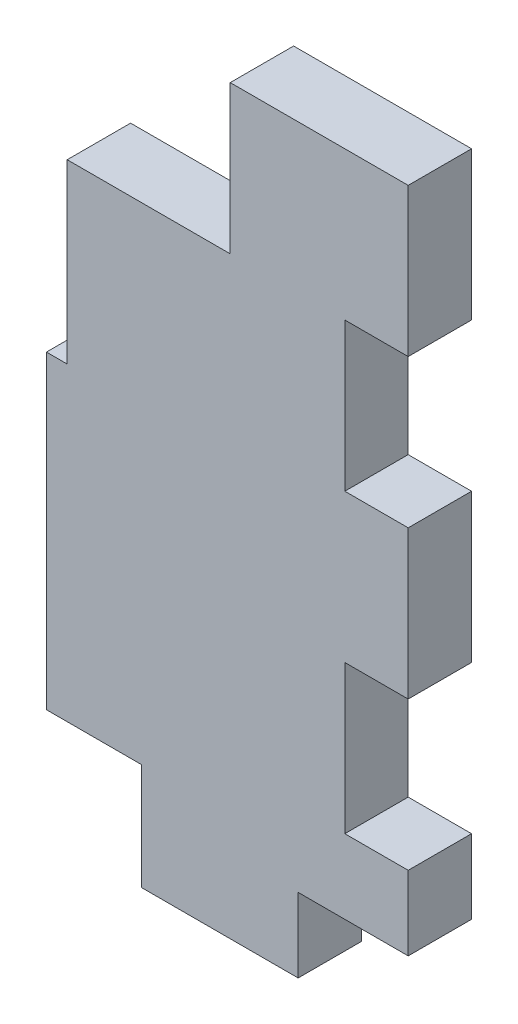
ISO-10303-21;
HEADER;
FILE_DESCRIPTION(('STEP AP214'),'2;1');
FILE_NAME('part.step','',(''),(''),'','','');
FILE_SCHEMA(('AUTOMOTIVE_DESIGN { 1 0 10303 214 1 1 1 1 }'));
ENDSEC;
DATA;
#1=APPLICATION_CONTEXT('core data for automotive mechanical design processes');
#2=APPLICATION_PROTOCOL_DEFINITION('international standard','automotive_design',2000,#1);
#3=PRODUCT_CONTEXT('',#1,'mechanical');
#4=PRODUCT('Part','Part','',(#3));
#5=PRODUCT_RELATED_PRODUCT_CATEGORY('part','',(#4));
#6=PRODUCT_DEFINITION_FORMATION('','',#4);
#7=PRODUCT_DEFINITION_CONTEXT('part definition',#1,'design');
#8=PRODUCT_DEFINITION('design','',#6,#7);
#9=PRODUCT_DEFINITION_SHAPE('','',#8);
#10=(LENGTH_UNIT() NAMED_UNIT(*) SI_UNIT(.MILLI.,.METRE.));
#11=(NAMED_UNIT(*) PLANE_ANGLE_UNIT() SI_UNIT($,.RADIAN.));
#12=(NAMED_UNIT(*) SI_UNIT($,.STERADIAN.) SOLID_ANGLE_UNIT());
#13=UNCERTAINTY_MEASURE_WITH_UNIT(LENGTH_MEASURE(1.E-05),#10,'distance_accuracy_value','');
#14=(GEOMETRIC_REPRESENTATION_CONTEXT(3) GLOBAL_UNCERTAINTY_ASSIGNED_CONTEXT((#13)) GLOBAL_UNIT_ASSIGNED_CONTEXT((#10,
#11,#12)) REPRESENTATION_CONTEXT('',''));
#15=CARTESIAN_POINT('',(0.,0.,0.));
#16=DIRECTION('',(0.,0.,1.));
#17=DIRECTION('',(1.,0.,0.));
#18=AXIS2_PLACEMENT_3D('',#15,#16,#17);
#19=CARTESIAN_POINT('',(12.8165225,0.,4.5593));
#20=DIRECTION('',(1.,0.,0.));
#21=DIRECTION('',(0.,0.,-1.));
#22=AXIS2_PLACEMENT_3D('',#19,#20,#21);
#23=PLANE('',#22);
#24=DIRECTION('',(0.,-1.,0.));
#25=VECTOR('',#24,1.);
#26=CARTESIAN_POINT('',(12.8165225,0.,0.));
#27=LINE('',#26,#25);
#28=CARTESIAN_POINT('',(12.8165225,-19.0119,0.));
#29=VERTEX_POINT('',#28);
#30=CARTESIAN_POINT('',(12.8165225,-26.67,0.));
#31=VERTEX_POINT('',#30);
#32=EDGE_CURVE('E200',#29,#31,#27,.T.);
#33=ORIENTED_EDGE('',*,*,#32,.T.);
#34=DIRECTION('',(0.,0.,-1.));
#35=VECTOR('',#34,1.);
#36=CARTESIAN_POINT('',(12.8165225,-26.67,4.5593));
#37=LINE('',#36,#35);
#38=CARTESIAN_POINT('',(12.8165225,-26.67,4.5593));
#39=VERTEX_POINT('',#38);
#40=EDGE_CURVE('E11',#39,#31,#37,.T.);
#41=ORIENTED_EDGE('',*,*,#40,.F.);
#42=DIRECTION('',(0.,-1.,0.));
#43=VECTOR('',#42,1.);
#44=CARTESIAN_POINT('',(12.8165225,0.,4.5593));
#45=LINE('',#44,#43);
#46=CARTESIAN_POINT('',(12.8165225,-19.0119,4.5593));
#47=VERTEX_POINT('',#46);
#48=EDGE_CURVE('E248',#47,#39,#45,.T.);
#49=ORIENTED_EDGE('',*,*,#48,.F.);
#50=DIRECTION('',(0.,0.,-1.));
#51=VECTOR('',#50,1.);
#52=CARTESIAN_POINT('',(12.8165225,-19.0119,4.5593));
#53=LINE('',#52,#51);
#54=EDGE_CURVE('E196',#47,#29,#53,.T.);
#55=ORIENTED_EDGE('',*,*,#54,.T.);
#56=EDGE_LOOP('',(#33,#41,#49,#55));
#57=FACE_BOUND('',#56,.T.);
#58=ADVANCED_FACE('F34',(#57),#23,.F.);
#59=CARTESIAN_POINT('',(0.,-26.67,4.5593));
#60=DIRECTION('',(0.,1.,0.));
#61=DIRECTION('',(0.,0.,1.));
#62=AXIS2_PLACEMENT_3D('',#59,#60,#61);
#63=PLANE('',#62);
#64=DIRECTION('',(1.,0.,0.));
#65=VECTOR('',#64,1.);
#66=CARTESIAN_POINT('',(0.,-26.67,0.));
#67=LINE('',#66,#65);
#68=CARTESIAN_POINT('',(24.0884075,-26.67,0.));
#69=VERTEX_POINT('',#68);
#70=EDGE_CURVE('E203',#31,#69,#67,.T.);
#71=ORIENTED_EDGE('',*,*,#70,.T.);
#72=DIRECTION('',(0.,0.,-1.));
#73=VECTOR('',#72,1.);
#74=CARTESIAN_POINT('',(24.0884075,-26.67,4.5593));
#75=LINE('',#74,#73);
#76=CARTESIAN_POINT('',(24.0884075,-26.67,4.5593));
#77=VERTEX_POINT('',#76);
#78=EDGE_CURVE('E42',#77,#69,#75,.T.);
#79=ORIENTED_EDGE('',*,*,#78,.F.);
#80=DIRECTION('',(1.,0.,0.));
#81=VECTOR('',#80,1.);
#82=CARTESIAN_POINT('',(0.,-26.67,4.5593));
#83=LINE('',#82,#81);
#84=EDGE_CURVE('E125',#39,#77,#83,.T.);
#85=ORIENTED_EDGE('',*,*,#84,.F.);
#86=ORIENTED_EDGE('',*,*,#40,.T.);
#87=EDGE_LOOP('',(#71,#79,#85,#86));
#88=FACE_BOUND('',#87,.T.);
#89=ADVANCED_FACE('F349',(#88),#63,.F.);
#90=CARTESIAN_POINT('',(24.0884075,0.,4.5593));
#91=DIRECTION('',(-1.,0.,0.));
#92=DIRECTION('',(0.,-1.,0.));
#93=AXIS2_PLACEMENT_3D('',#90,#91,#92);
#94=PLANE('',#93);
#95=DIRECTION('',(0.,1.,0.));
#96=VECTOR('',#95,1.);
#97=CARTESIAN_POINT('',(24.0884075,0.,0.));
#98=LINE('',#97,#96);
#99=CARTESIAN_POINT('',(24.0884075,-21.336,0.));
#100=VERTEX_POINT('',#99);
#101=EDGE_CURVE('E205',#69,#100,#98,.T.);
#102=ORIENTED_EDGE('',*,*,#101,.T.);
#103=DIRECTION('',(0.,0.,-1.));
#104=VECTOR('',#103,1.);
#105=CARTESIAN_POINT('',(24.0884075,-21.336,4.5593));
#106=LINE('',#105,#104);
#107=CARTESIAN_POINT('',(24.0884075,-21.336,4.5593));
#108=VERTEX_POINT('',#107);
#109=EDGE_CURVE('E281',#108,#100,#106,.T.);
#110=ORIENTED_EDGE('',*,*,#109,.F.);
#111=DIRECTION('',(0.,1.,0.));
#112=VECTOR('',#111,1.);
#113=CARTESIAN_POINT('',(24.0884075,0.,4.5593));
#114=LINE('',#113,#112);
#115=EDGE_CURVE('E288',#77,#108,#114,.T.);
#116=ORIENTED_EDGE('',*,*,#115,.F.);
#117=ORIENTED_EDGE('',*,*,#78,.T.);
#118=EDGE_LOOP('',(#102,#110,#116,#117));
#119=FACE_BOUND('',#118,.T.);
#120=ADVANCED_FACE('F286',(#119),#94,.F.);
#121=CARTESIAN_POINT('',(0.,-21.3360000000001,4.5593));
#122=DIRECTION('',(0.,-1.,0.));
#123=DIRECTION('',(1.,0.,0.));
#124=AXIS2_PLACEMENT_3D('',#121,#122,#123);
#125=PLANE('',#124);
#126=DIRECTION('',(-1.,0.,0.));
#127=VECTOR('',#126,1.);
#128=CARTESIAN_POINT('',(0.,-21.3360000000001,0.));
#129=LINE('',#128,#127);
#130=CARTESIAN_POINT('',(32.004,-21.336,0.));
#131=VERTEX_POINT('',#130);
#132=EDGE_CURVE('E208',#131,#100,#129,.T.);
#133=ORIENTED_EDGE('',*,*,#132,.F.);
#134=DIRECTION('',(0.,0.,-1.));
#135=VECTOR('',#134,1.);
#136=CARTESIAN_POINT('',(32.004,-21.336,4.5593));
#137=LINE('',#136,#135);
#138=CARTESIAN_POINT('',(32.004,-21.336,4.5593));
#139=VERTEX_POINT('',#138);
#140=EDGE_CURVE('E279',#139,#131,#137,.T.);
#141=ORIENTED_EDGE('',*,*,#140,.F.);
#142=DIRECTION('',(-1.,0.,0.));
#143=VECTOR('',#142,1.);
#144=CARTESIAN_POINT('',(0.,-21.3360000000001,4.5593));
#145=LINE('',#144,#143);
#146=EDGE_CURVE('E299',#139,#108,#145,.T.);
#147=ORIENTED_EDGE('',*,*,#146,.T.);
#148=ORIENTED_EDGE('',*,*,#109,.T.);
#149=EDGE_LOOP('',(#133,#141,#147,#148));
#150=FACE_BOUND('',#149,.T.);
#151=ADVANCED_FACE('F295',(#150),#125,.T.);
#152=CARTESIAN_POINT('',(32.004,0.,4.5593));
#153=DIRECTION('',(-1.,0.,0.));
#154=DIRECTION('',(0.,0.,1.));
#155=AXIS2_PLACEMENT_3D('',#152,#153,#154);
#156=PLANE('',#155);
#157=DIRECTION('',(0.,1.,0.));
#158=VECTOR('',#157,1.);
#159=CARTESIAN_POINT('',(32.004,0.,0.));
#160=LINE('',#159,#158);
#161=CARTESIAN_POINT('',(32.004,-16.002,0.));
#162=VERTEX_POINT('',#161);
#163=EDGE_CURVE('E211',#131,#162,#160,.T.);
#164=ORIENTED_EDGE('',*,*,#163,.T.);
#165=DIRECTION('',(0.,0.,-1.));
#166=VECTOR('',#165,1.);
#167=CARTESIAN_POINT('',(32.004,-16.002,4.5593));
#168=LINE('',#167,#166);
#169=CARTESIAN_POINT('',(32.004,-16.002,4.5593));
#170=VERTEX_POINT('',#169);
#171=EDGE_CURVE('E277',#170,#162,#168,.T.);
#172=ORIENTED_EDGE('',*,*,#171,.F.);
#173=DIRECTION('',(0.,1.,0.));
#174=VECTOR('',#173,1.);
#175=CARTESIAN_POINT('',(32.004,0.,4.5593));
#176=LINE('',#175,#174);
#177=EDGE_CURVE('E300',#139,#170,#176,.T.);
#178=ORIENTED_EDGE('',*,*,#177,.F.);
#179=ORIENTED_EDGE('',*,*,#140,.T.);
#180=EDGE_LOOP('',(#164,#172,#178,#179));
#181=FACE_BOUND('',#180,.T.);
#182=ADVANCED_FACE('F360',(#181),#156,.F.);
#183=CARTESIAN_POINT('',(0.,-16.0020000000001,4.5593));
#184=DIRECTION('',(0.,1.,0.));
#185=DIRECTION('',(-1.,0.,0.));
#186=AXIS2_PLACEMENT_3D('',#183,#184,#185);
#187=PLANE('',#186);
#188=DIRECTION('',(1.,0.,0.));
#189=VECTOR('',#188,1.);
#190=CARTESIAN_POINT('',(0.,-16.0020000000001,0.));
#191=LINE('',#190,#189);
#192=CARTESIAN_POINT('',(27.4447,-16.002,0.));
#193=VERTEX_POINT('',#192);
#194=EDGE_CURVE('E214',#193,#162,#191,.T.);
#195=ORIENTED_EDGE('',*,*,#194,.F.);
#196=DIRECTION('',(0.,0.,-1.));
#197=VECTOR('',#196,1.);
#198=CARTESIAN_POINT('',(27.4447,-16.002,4.5593));
#199=LINE('',#198,#197);
#200=CARTESIAN_POINT('',(27.4447,-16.002,4.5593));
#201=VERTEX_POINT('',#200);
#202=EDGE_CURVE('E275',#201,#193,#199,.T.);
#203=ORIENTED_EDGE('',*,*,#202,.F.);
#204=DIRECTION('',(1.,0.,0.));
#205=VECTOR('',#204,1.);
#206=CARTESIAN_POINT('',(0.,-16.0020000000001,4.5593));
#207=LINE('',#206,#205);
#208=EDGE_CURVE('E302',#201,#170,#207,.T.);
#209=ORIENTED_EDGE('',*,*,#208,.T.);
#210=ORIENTED_EDGE('',*,*,#171,.T.);
#211=EDGE_LOOP('',(#195,#203,#209,#210));
#212=FACE_BOUND('',#211,.T.);
#213=ADVANCED_FACE('F361',(#212),#187,.T.);
#214=CARTESIAN_POINT('',(27.4447,0.,4.5593));
#215=DIRECTION('',(1.,0.,0.));
#216=DIRECTION('',(0.,0.,-1.));
#217=AXIS2_PLACEMENT_3D('',#214,#215,#216);
#218=PLANE('',#217);
#219=DIRECTION('',(0.,-1.,0.));
#220=VECTOR('',#219,1.);
#221=CARTESIAN_POINT('',(27.4447,0.,0.));
#222=LINE('',#221,#220);
#223=CARTESIAN_POINT('',(27.4447,-5.334,0.));
#224=VERTEX_POINT('',#223);
#225=EDGE_CURVE('E219',#224,#193,#222,.T.);
#226=ORIENTED_EDGE('',*,*,#225,.F.);
#227=DIRECTION('',(0.,0.,-1.));
#228=VECTOR('',#227,1.);
#229=CARTESIAN_POINT('',(27.4447,-5.334,4.5593));
#230=LINE('',#229,#228);
#231=CARTESIAN_POINT('',(27.4447,-5.334,4.5593));
#232=VERTEX_POINT('',#231);
#233=EDGE_CURVE('E273',#232,#224,#230,.T.);
#234=ORIENTED_EDGE('',*,*,#233,.F.);
#235=DIRECTION('',(0.,-1.,0.));
#236=VECTOR('',#235,1.);
#237=CARTESIAN_POINT('',(27.4447,0.,4.5593));
#238=LINE('',#237,#236);
#239=EDGE_CURVE('E311',#232,#201,#238,.T.);
#240=ORIENTED_EDGE('',*,*,#239,.T.);
#241=ORIENTED_EDGE('',*,*,#202,.T.);
#242=EDGE_LOOP('',(#226,#234,#240,#241));
#243=FACE_BOUND('',#242,.T.);
#244=ADVANCED_FACE('F364',(#243),#218,.T.);
#245=CARTESIAN_POINT('',(0.,-5.33400000000002,4.5593));
#246=DIRECTION('',(0.,1.,0.));
#247=DIRECTION('',(-1.,0.,0.));
#248=AXIS2_PLACEMENT_3D('',#245,#246,#247);
#249=PLANE('',#248);
#250=DIRECTION('',(1.,0.,0.));
#251=VECTOR('',#250,1.);
#252=CARTESIAN_POINT('',(0.,-5.33400000000002,0.));
#253=LINE('',#252,#251);
#254=CARTESIAN_POINT('',(32.004,-5.334,0.));
#255=VERTEX_POINT('',#254);
#256=EDGE_CURVE('E222',#224,#255,#253,.T.);
#257=ORIENTED_EDGE('',*,*,#256,.T.);
#258=DIRECTION('',(0.,0.,-1.));
#259=VECTOR('',#258,1.);
#260=CARTESIAN_POINT('',(32.004,-5.334,4.5593));
#261=LINE('',#260,#259);
#262=CARTESIAN_POINT('',(32.004,-5.334,4.5593));
#263=VERTEX_POINT('',#262);
#264=EDGE_CURVE('E270',#263,#255,#261,.T.);
#265=ORIENTED_EDGE('',*,*,#264,.F.);
#266=DIRECTION('',(1.,0.,0.));
#267=VECTOR('',#266,1.);
#268=CARTESIAN_POINT('',(0.,-5.33400000000002,4.5593));
#269=LINE('',#268,#267);
#270=EDGE_CURVE('E314',#232,#263,#269,.T.);
#271=ORIENTED_EDGE('',*,*,#270,.F.);
#272=ORIENTED_EDGE('',*,*,#233,.T.);
#273=EDGE_LOOP('',(#257,#265,#271,#272));
#274=FACE_BOUND('',#273,.T.);
#275=ADVANCED_FACE('F368',(#274),#249,.F.);
#276=CARTESIAN_POINT('',(32.004,5.334,0.));
#277=VERTEX_POINT('',#276);
#278=EDGE_CURVE('E216',#255,#277,#160,.T.);
#279=ORIENTED_EDGE('',*,*,#278,.T.);
#280=DIRECTION('',(0.,0.,-1.));
#281=VECTOR('',#280,1.);
#282=CARTESIAN_POINT('',(32.004,5.334,4.5593));
#283=LINE('',#282,#281);
#284=CARTESIAN_POINT('',(32.004,5.334,4.5593));
#285=VERTEX_POINT('',#284);
#286=EDGE_CURVE('E268',#285,#277,#283,.T.);
#287=ORIENTED_EDGE('',*,*,#286,.F.);
#288=EDGE_CURVE('E305',#263,#285,#176,.T.);
#289=ORIENTED_EDGE('',*,*,#288,.F.);
#290=ORIENTED_EDGE('',*,*,#264,.T.);
#291=EDGE_LOOP('',(#279,#287,#289,#290));
#292=FACE_BOUND('',#291,.T.);
#293=ADVANCED_FACE('F372',(#292),#156,.F.);
#294=CARTESIAN_POINT('',(0.,5.334,4.5593));
#295=DIRECTION('',(0.,1.,0.));
#296=DIRECTION('',(0.,0.,1.));
#297=AXIS2_PLACEMENT_3D('',#294,#295,#296);
#298=PLANE('',#297);
#299=DIRECTION('',(1.,0.,0.));
#300=VECTOR('',#299,1.);
#301=CARTESIAN_POINT('',(0.,5.334,0.));
#302=LINE('',#301,#300);
#303=CARTESIAN_POINT('',(27.4447,5.334,0.));
#304=VERTEX_POINT('',#303);
#305=EDGE_CURVE('E224',#304,#277,#302,.T.);
#306=ORIENTED_EDGE('',*,*,#305,.F.);
#307=DIRECTION('',(0.,0.,-1.));
#308=VECTOR('',#307,1.);
#309=CARTESIAN_POINT('',(27.4447,5.334,4.5593));
#310=LINE('',#309,#308);
#311=CARTESIAN_POINT('',(27.4447,5.334,4.5593));
#312=VERTEX_POINT('',#311);
#313=EDGE_CURVE('E266',#312,#304,#310,.T.);
#314=ORIENTED_EDGE('',*,*,#313,.F.);
#315=DIRECTION('',(1.,0.,0.));
#316=VECTOR('',#315,1.);
#317=CARTESIAN_POINT('',(0.,5.334,4.5593));
#318=LINE('',#317,#316);
#319=EDGE_CURVE('E316',#312,#285,#318,.T.);
#320=ORIENTED_EDGE('',*,*,#319,.T.);
#321=ORIENTED_EDGE('',*,*,#286,.T.);
#322=EDGE_LOOP('',(#306,#314,#320,#321));
#323=FACE_BOUND('',#322,.T.);
#324=ADVANCED_FACE('F374',(#323),#298,.T.);
#325=CARTESIAN_POINT('',(27.4447,0.,4.5593));
#326=DIRECTION('',(1.,0.,0.));
#327=DIRECTION('',(0.,0.,-1.));
#328=AXIS2_PLACEMENT_3D('',#325,#326,#327);
#329=PLANE('',#328);
#330=DIRECTION('',(0.,-1.,0.));
#331=VECTOR('',#330,1.);
#332=CARTESIAN_POINT('',(27.4447,0.,0.));
#333=LINE('',#332,#331);
#334=CARTESIAN_POINT('',(27.4447,16.002,0.));
#335=VERTEX_POINT('',#334);
#336=EDGE_CURVE('E227',#335,#304,#333,.T.);
#337=ORIENTED_EDGE('',*,*,#336,.F.);
#338=DIRECTION('',(0.,0.,-1.));
#339=VECTOR('',#338,1.);
#340=CARTESIAN_POINT('',(27.4447,16.002,4.5593));
#341=LINE('',#340,#339);
#342=CARTESIAN_POINT('',(27.4447,16.002,4.5593));
#343=VERTEX_POINT('',#342);
#344=EDGE_CURVE('E264',#343,#335,#341,.T.);
#345=ORIENTED_EDGE('',*,*,#344,.F.);
#346=DIRECTION('',(0.,-1.,0.));
#347=VECTOR('',#346,1.);
#348=CARTESIAN_POINT('',(27.4447,0.,4.5593));
#349=LINE('',#348,#347);
#350=EDGE_CURVE('E319',#343,#312,#349,.T.);
#351=ORIENTED_EDGE('',*,*,#350,.T.);
#352=ORIENTED_EDGE('',*,*,#313,.T.);
#353=EDGE_LOOP('',(#337,#345,#351,#352));
#354=FACE_BOUND('',#353,.T.);
#355=ADVANCED_FACE('F377',(#354),#329,.T.);
#356=CARTESIAN_POINT('',(0.,16.002,4.5593));
#357=DIRECTION('',(0.,1.,0.));
#358=DIRECTION('',(-1.,0.,0.));
#359=AXIS2_PLACEMENT_3D('',#356,#357,#358);
#360=PLANE('',#359);
#361=DIRECTION('',(1.,0.,0.));
#362=VECTOR('',#361,1.);
#363=CARTESIAN_POINT('',(0.,16.002,0.));
#364=LINE('',#363,#362);
#365=CARTESIAN_POINT('',(32.004,16.002,0.));
#366=VERTEX_POINT('',#365);
#367=EDGE_CURVE('E230',#335,#366,#364,.T.);
#368=ORIENTED_EDGE('',*,*,#367,.T.);
#369=DIRECTION('',(0.,0.,-1.));
#370=VECTOR('',#369,1.);
#371=CARTESIAN_POINT('',(32.004,16.002,4.5593));
#372=LINE('',#371,#370);
#373=CARTESIAN_POINT('',(32.004,16.002,4.5593));
#374=VERTEX_POINT('',#373);
#375=EDGE_CURVE('E261',#374,#366,#372,.T.);
#376=ORIENTED_EDGE('',*,*,#375,.F.);
#377=DIRECTION('',(1.,0.,0.));
#378=VECTOR('',#377,1.);
#379=CARTESIAN_POINT('',(0.,16.002,4.5593));
#380=LINE('',#379,#378);
#381=EDGE_CURVE('E322',#343,#374,#380,.T.);
#382=ORIENTED_EDGE('',*,*,#381,.F.);
#383=ORIENTED_EDGE('',*,*,#344,.T.);
#384=EDGE_LOOP('',(#368,#376,#382,#383));
#385=FACE_BOUND('',#384,.T.);
#386=ADVANCED_FACE('F381',(#385),#360,.F.);
#387=CARTESIAN_POINT('',(32.004,26.67,0.));
#388=VERTEX_POINT('',#387);
#389=EDGE_CURVE('E215',#366,#388,#160,.T.);
#390=ORIENTED_EDGE('',*,*,#389,.T.);
#391=DIRECTION('',(0.,0.,-1.));
#392=VECTOR('',#391,1.);
#393=CARTESIAN_POINT('',(32.004,26.67,4.5593));
#394=LINE('',#393,#392);
#395=CARTESIAN_POINT('',(32.004,26.67,4.5593));
#396=VERTEX_POINT('',#395);
#397=EDGE_CURVE('E258',#396,#388,#394,.T.);
#398=ORIENTED_EDGE('',*,*,#397,.F.);
#399=EDGE_CURVE('E304',#374,#396,#176,.T.);
#400=ORIENTED_EDGE('',*,*,#399,.F.);
#401=ORIENTED_EDGE('',*,*,#375,.T.);
#402=EDGE_LOOP('',(#390,#398,#400,#401));
#403=FACE_BOUND('',#402,.T.);
#404=ADVANCED_FACE('F385',(#403),#156,.F.);
#405=CARTESIAN_POINT('',(0.,26.67,4.5593));
#406=DIRECTION('',(0.,-1.,0.));
#407=DIRECTION('',(0.,0.,-1.));
#408=AXIS2_PLACEMENT_3D('',#405,#406,#407);
#409=PLANE('',#408);
#410=DIRECTION('',(-1.,0.,0.));
#411=VECTOR('',#410,1.);
#412=CARTESIAN_POINT('',(0.,26.67,0.));
#413=LINE('',#412,#411);
#414=CARTESIAN_POINT('',(19.2024,26.67,0.));
#415=VERTEX_POINT('',#414);
#416=EDGE_CURVE('E232',#388,#415,#413,.T.);
#417=ORIENTED_EDGE('',*,*,#416,.T.);
#418=DIRECTION('',(0.,0.,-1.));
#419=VECTOR('',#418,1.);
#420=CARTESIAN_POINT('',(19.2024,26.67,4.5593));
#421=LINE('',#420,#419);
#422=CARTESIAN_POINT('',(19.2024,26.67,4.5593));
#423=VERTEX_POINT('',#422);
#424=EDGE_CURVE('E256',#423,#415,#421,.T.);
#425=ORIENTED_EDGE('',*,*,#424,.F.);
#426=DIRECTION('',(-1.,0.,0.));
#427=VECTOR('',#426,1.);
#428=CARTESIAN_POINT('',(0.,26.67,4.5593));
#429=LINE('',#428,#427);
#430=EDGE_CURVE('E324',#396,#423,#429,.T.);
#431=ORIENTED_EDGE('',*,*,#430,.F.);
#432=ORIENTED_EDGE('',*,*,#397,.T.);
#433=EDGE_LOOP('',(#417,#425,#431,#432));
#434=FACE_BOUND('',#433,.T.);
#435=ADVANCED_FACE('F389',(#434),#409,.F.);
#436=CARTESIAN_POINT('',(19.2024,0.,4.5593));
#437=DIRECTION('',(-1.,0.,0.));
#438=DIRECTION('',(0.,-1.,0.));
#439=AXIS2_PLACEMENT_3D('',#436,#437,#438);
#440=PLANE('',#439);
#441=DIRECTION('',(0.,1.,0.));
#442=VECTOR('',#441,1.);
#443=CARTESIAN_POINT('',(19.2024,0.,0.));
#444=LINE('',#443,#442);
#445=CARTESIAN_POINT('',(19.2024,16.002,0.));
#446=VERTEX_POINT('',#445);
#447=EDGE_CURVE('E235',#446,#415,#444,.T.);
#448=ORIENTED_EDGE('',*,*,#447,.F.);
#449=DIRECTION('',(0.,0.,-1.));
#450=VECTOR('',#449,1.);
#451=CARTESIAN_POINT('',(19.2024,16.002,4.5593));
#452=LINE('',#451,#450);
#453=CARTESIAN_POINT('',(19.2024,16.002,4.5593));
#454=VERTEX_POINT('',#453);
#455=EDGE_CURVE('E254',#454,#446,#452,.T.);
#456=ORIENTED_EDGE('',*,*,#455,.F.);
#457=DIRECTION('',(0.,1.,0.));
#458=VECTOR('',#457,1.);
#459=CARTESIAN_POINT('',(19.2024,0.,4.5593));
#460=LINE('',#459,#458);
#461=EDGE_CURVE('E326',#454,#423,#460,.T.);
#462=ORIENTED_EDGE('',*,*,#461,.T.);
#463=ORIENTED_EDGE('',*,*,#424,.T.);
#464=EDGE_LOOP('',(#448,#456,#462,#463));
#465=FACE_BOUND('',#464,.T.);
#466=ADVANCED_FACE('F393',(#465),#440,.T.);
#467=CARTESIAN_POINT('',(0.,16.002,4.5593));
#468=DIRECTION('',(0.,-1.,0.));
#469=DIRECTION('',(0.,0.,-1.));
#470=AXIS2_PLACEMENT_3D('',#467,#468,#469);
#471=PLANE('',#470);
#472=DIRECTION('',(-1.,0.,0.));
#473=VECTOR('',#472,1.);
#474=CARTESIAN_POINT('',(0.,16.002,0.));
#475=LINE('',#474,#473);
#476=CARTESIAN_POINT('',(7.47522,16.002,0.));
#477=VERTEX_POINT('',#476);
#478=EDGE_CURVE('E238',#446,#477,#475,.T.);
#479=ORIENTED_EDGE('',*,*,#478,.T.);
#480=DIRECTION('',(0.,0.,-1.));
#481=VECTOR('',#480,1.);
#482=CARTESIAN_POINT('',(7.47522,16.002,4.5593));
#483=LINE('',#482,#481);
#484=CARTESIAN_POINT('',(7.47522,16.002,4.5593));
#485=VERTEX_POINT('',#484);
#486=EDGE_CURVE('E252',#485,#477,#483,.T.);
#487=ORIENTED_EDGE('',*,*,#486,.F.);
#488=DIRECTION('',(-1.,0.,0.));
#489=VECTOR('',#488,1.);
#490=CARTESIAN_POINT('',(0.,16.002,4.5593));
#491=LINE('',#490,#489);
#492=EDGE_CURVE('E329',#454,#485,#491,.T.);
#493=ORIENTED_EDGE('',*,*,#492,.F.);
#494=ORIENTED_EDGE('',*,*,#455,.T.);
#495=EDGE_LOOP('',(#479,#487,#493,#494));
#496=FACE_BOUND('',#495,.T.);
#497=ADVANCED_FACE('F397',(#496),#471,.F.);
#498=CARTESIAN_POINT('',(7.47522000000001,0.,4.5593));
#499=DIRECTION('',(-1.,0.,0.));
#500=DIRECTION('',(0.,-1.,0.));
#501=AXIS2_PLACEMENT_3D('',#498,#499,#500);
#502=PLANE('',#501);
#503=DIRECTION('',(0.,1.,0.));
#504=VECTOR('',#503,1.);
#505=CARTESIAN_POINT('',(7.47522000000001,0.,0.));
#506=LINE('',#505,#504);
#507=CARTESIAN_POINT('',(7.47522,3.27151999999999,0.));
#508=VERTEX_POINT('',#507);
#509=EDGE_CURVE('E241',#508,#477,#506,.T.);
#510=ORIENTED_EDGE('',*,*,#509,.F.);
#511=DIRECTION('',(0.,0.,-1.));
#512=VECTOR('',#511,1.);
#513=CARTESIAN_POINT('',(7.47522,3.27151999999999,4.5593));
#514=LINE('',#513,#512);
#515=CARTESIAN_POINT('',(7.47522,3.27151999999999,4.5593));
#516=VERTEX_POINT('',#515);
#517=EDGE_CURVE('E192',#516,#508,#514,.T.);
#518=ORIENTED_EDGE('',*,*,#517,.F.);
#519=DIRECTION('',(0.,1.,0.));
#520=VECTOR('',#519,1.);
#521=CARTESIAN_POINT('',(7.47522000000001,0.,4.5593));
#522=LINE('',#521,#520);
#523=EDGE_CURVE('E181',#516,#485,#522,.T.);
#524=ORIENTED_EDGE('',*,*,#523,.T.);
#525=ORIENTED_EDGE('',*,*,#486,.T.);
#526=EDGE_LOOP('',(#510,#518,#524,#525));
#527=FACE_BOUND('',#526,.T.);
#528=ADVANCED_FACE('F332',(#527),#502,.T.);
#529=CARTESIAN_POINT('',(0.,3.27152,4.5593));
#530=DIRECTION('',(0.,-1.,0.));
#531=DIRECTION('',(1.,0.,0.));
#532=AXIS2_PLACEMENT_3D('',#529,#530,#531);
#533=PLANE('',#532);
#534=DIRECTION('',(-1.,0.,0.));
#535=VECTOR('',#534,1.);
#536=CARTESIAN_POINT('',(0.,3.27152,0.));
#537=LINE('',#536,#535);
#538=CARTESIAN_POINT('',(5.980176,3.27151999999999,0.));
#539=VERTEX_POINT('',#538);
#540=EDGE_CURVE('E188',#508,#539,#537,.T.);
#541=ORIENTED_EDGE('',*,*,#540,.T.);
#542=DIRECTION('',(0.,0.,-1.));
#543=VECTOR('',#542,1.);
#544=CARTESIAN_POINT('',(5.980176,3.27151999999999,4.5593));
#545=LINE('',#544,#543);
#546=CARTESIAN_POINT('',(5.980176,3.27151999999999,4.5593));
#547=VERTEX_POINT('',#546);
#548=EDGE_CURVE('E185',#547,#539,#545,.T.);
#549=ORIENTED_EDGE('',*,*,#548,.F.);
#550=DIRECTION('',(-1.,0.,0.));
#551=VECTOR('',#550,1.);
#552=CARTESIAN_POINT('',(0.,3.27152,4.5593));
#553=LINE('',#552,#551);
#554=EDGE_CURVE('E175',#516,#547,#553,.T.);
#555=ORIENTED_EDGE('',*,*,#554,.F.);
#556=ORIENTED_EDGE('',*,*,#517,.T.);
#557=EDGE_LOOP('',(#541,#549,#555,#556));
#558=FACE_BOUND('',#557,.T.);
#559=ADVANCED_FACE('F186',(#558),#533,.F.);
#560=CARTESIAN_POINT('',(5.980176,0.,4.5593));
#561=DIRECTION('',(-1.,0.,0.));
#562=DIRECTION('',(0.,0.,1.));
#563=AXIS2_PLACEMENT_3D('',#560,#561,#562);
#564=PLANE('',#563);
#565=DIRECTION('',(0.,1.,0.));
#566=VECTOR('',#565,1.);
#567=CARTESIAN_POINT('',(5.980176,0.,0.));
#568=LINE('',#567,#566);
#569=CARTESIAN_POINT('',(5.980176,-19.0119,0.));
#570=VERTEX_POINT('',#569);
#571=EDGE_CURVE('E245',#570,#539,#568,.T.);
#572=ORIENTED_EDGE('',*,*,#571,.F.);
#573=DIRECTION('',(0.,0.,-1.));
#574=VECTOR('',#573,1.);
#575=CARTESIAN_POINT('',(5.980176,-19.0119,4.5593));
#576=LINE('',#575,#574);
#577=CARTESIAN_POINT('',(5.980176,-19.0119,4.5593));
#578=VERTEX_POINT('',#577);
#579=EDGE_CURVE('E114',#578,#570,#576,.T.);
#580=ORIENTED_EDGE('',*,*,#579,.F.);
#581=DIRECTION('',(0.,1.,0.));
#582=VECTOR('',#581,1.);
#583=CARTESIAN_POINT('',(5.980176,0.,4.5593));
#584=LINE('',#583,#582);
#585=EDGE_CURVE('E179',#578,#547,#584,.T.);
#586=ORIENTED_EDGE('',*,*,#585,.T.);
#587=ORIENTED_EDGE('',*,*,#548,.T.);
#588=EDGE_LOOP('',(#572,#580,#586,#587));
#589=FACE_BOUND('',#588,.T.);
#590=ADVANCED_FACE('F194',(#589),#564,.T.);
#591=CARTESIAN_POINT('',(0.,-19.0119,4.5593));
#592=DIRECTION('',(0.,1.,0.));
#593=DIRECTION('',(-1.,0.,0.));
#594=AXIS2_PLACEMENT_3D('',#591,#592,#593);
#595=PLANE('',#594);
#596=DIRECTION('',(1.,0.,0.));
#597=VECTOR('',#596,1.);
#598=CARTESIAN_POINT('',(0.,-19.0119,0.));
#599=LINE('',#598,#597);
#600=EDGE_CURVE('E117',#570,#29,#599,.T.);
#601=ORIENTED_EDGE('',*,*,#600,.T.);
#602=ORIENTED_EDGE('',*,*,#54,.F.);
#603=DIRECTION('',(1.,0.,0.));
#604=VECTOR('',#603,1.);
#605=CARTESIAN_POINT('',(0.,-19.0119,4.5593));
#606=LINE('',#605,#604);
#607=EDGE_CURVE('E50',#578,#47,#606,.T.);
#608=ORIENTED_EDGE('',*,*,#607,.F.);
#609=ORIENTED_EDGE('',*,*,#579,.T.);
#610=EDGE_LOOP('',(#601,#602,#608,#609));
#611=FACE_BOUND('',#610,.T.);
#612=ADVANCED_FACE('F338',(#611),#595,.F.);
#613=CARTESIAN_POINT('',(0.,0.,4.5593));
#614=DIRECTION('',(0.,0.,1.));
#615=DIRECTION('',(1.,0.,0.));
#616=AXIS2_PLACEMENT_3D('',#613,#614,#615);
#617=PLANE('',#616);
#618=ORIENTED_EDGE('',*,*,#48,.T.);
#619=ORIENTED_EDGE('',*,*,#84,.T.);
#620=ORIENTED_EDGE('',*,*,#115,.T.);
#621=ORIENTED_EDGE('',*,*,#146,.F.);
#622=ORIENTED_EDGE('',*,*,#177,.T.);
#623=ORIENTED_EDGE('',*,*,#208,.F.);
#624=ORIENTED_EDGE('',*,*,#239,.F.);
#625=ORIENTED_EDGE('',*,*,#270,.T.);
#626=ORIENTED_EDGE('',*,*,#288,.T.);
#627=ORIENTED_EDGE('',*,*,#319,.F.);
#628=ORIENTED_EDGE('',*,*,#350,.F.);
#629=ORIENTED_EDGE('',*,*,#381,.T.);
#630=ORIENTED_EDGE('',*,*,#399,.T.);
#631=ORIENTED_EDGE('',*,*,#430,.T.);
#632=ORIENTED_EDGE('',*,*,#461,.F.);
#633=ORIENTED_EDGE('',*,*,#492,.T.);
#634=ORIENTED_EDGE('',*,*,#523,.F.);
#635=ORIENTED_EDGE('',*,*,#554,.T.);
#636=ORIENTED_EDGE('',*,*,#585,.F.);
#637=ORIENTED_EDGE('',*,*,#607,.T.);
#638=EDGE_LOOP('',(#618,#619,#620,#621,#622,#623,#624,#625,#626,#627,#628,#629,#630,#631,#632,
#633,#634,#635,#636,#637));
#639=FACE_BOUND('',#638,.T.);
#640=ADVANCED_FACE('F177',(#639),#617,.T.);
#641=CARTESIAN_POINT('',(0.,0.,0.));
#642=DIRECTION('',(0.,0.,1.));
#643=DIRECTION('',(1.,0.,0.));
#644=AXIS2_PLACEMENT_3D('',#641,#642,#643);
#645=PLANE('',#644);
#646=ORIENTED_EDGE('',*,*,#32,.F.);
#647=ORIENTED_EDGE('',*,*,#600,.F.);
#648=ORIENTED_EDGE('',*,*,#571,.T.);
#649=ORIENTED_EDGE('',*,*,#540,.F.);
#650=ORIENTED_EDGE('',*,*,#509,.T.);
#651=ORIENTED_EDGE('',*,*,#478,.F.);
#652=ORIENTED_EDGE('',*,*,#447,.T.);
#653=ORIENTED_EDGE('',*,*,#416,.F.);
#654=ORIENTED_EDGE('',*,*,#389,.F.);
#655=ORIENTED_EDGE('',*,*,#367,.F.);
#656=ORIENTED_EDGE('',*,*,#336,.T.);
#657=ORIENTED_EDGE('',*,*,#305,.T.);
#658=ORIENTED_EDGE('',*,*,#278,.F.);
#659=ORIENTED_EDGE('',*,*,#256,.F.);
#660=ORIENTED_EDGE('',*,*,#225,.T.);
#661=ORIENTED_EDGE('',*,*,#194,.T.);
#662=ORIENTED_EDGE('',*,*,#163,.F.);
#663=ORIENTED_EDGE('',*,*,#132,.T.);
#664=ORIENTED_EDGE('',*,*,#101,.F.);
#665=ORIENTED_EDGE('',*,*,#70,.F.);
#666=EDGE_LOOP('',(#646,#647,#648,#649,#650,#651,#652,#653,#654,#655,#656,#657,#658,#659,#660,
#661,#662,#663,#664,#665));
#667=FACE_BOUND('',#666,.T.);
#668=ADVANCED_FACE('F291',(#667),#645,.F.);
#669=CLOSED_SHELL('',(#58,#89,#120,#151,#182,#213,#244,#275,#293,#324,#355,#386,#404,#435,#466,
#497,#528,#559,#590,#612,#640,#668));
#670=MANIFOLD_SOLID_BREP('B2',#669);
#671=ADVANCED_BREP_SHAPE_REPRESENTATION('',(#18,#670),#14);
#672=SHAPE_DEFINITION_REPRESENTATION(#9,#671);
ENDSEC;
END-ISO-10303-21;
